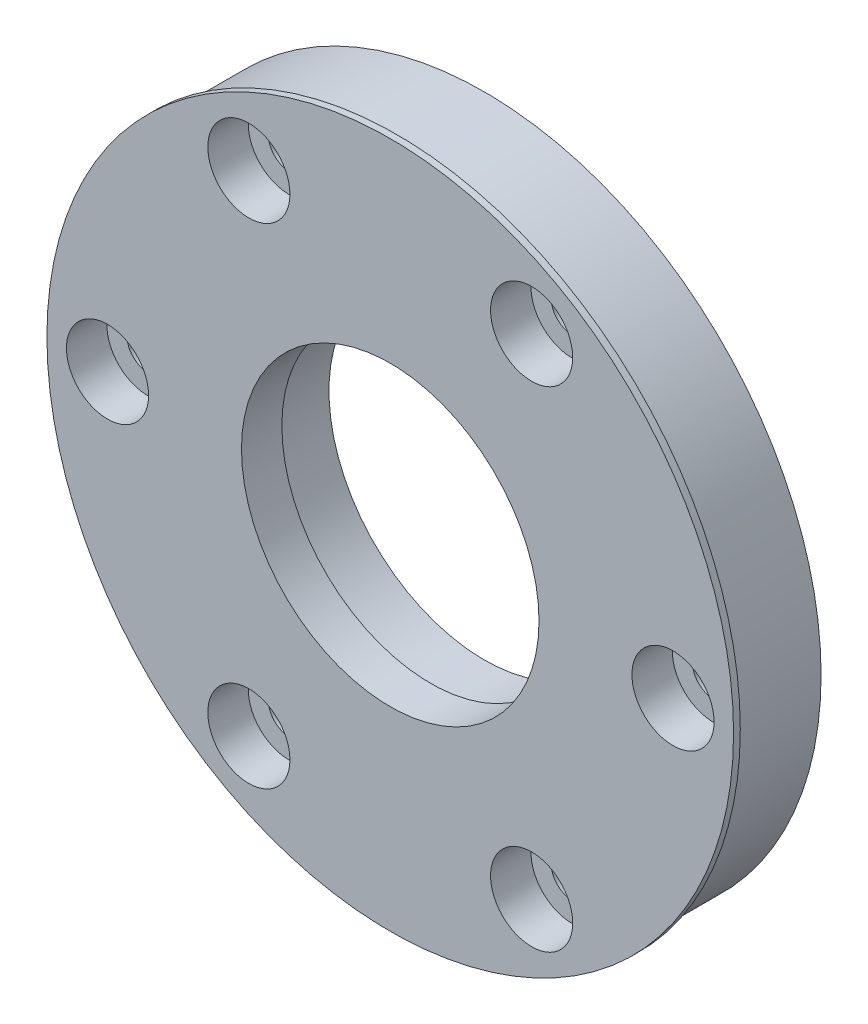
ISO-10303-21;
HEADER;
FILE_DESCRIPTION(('STEP AP214'),'2;1');
FILE_NAME('part.step','',(''),(''),'','','');
FILE_SCHEMA(('AUTOMOTIVE_DESIGN { 1 0 10303 214 1 1 1 1 }'));
ENDSEC;
DATA;
#1=APPLICATION_CONTEXT('core data for automotive mechanical design processes');
#2=APPLICATION_PROTOCOL_DEFINITION('international standard','automotive_design',2000,#1);
#3=PRODUCT_CONTEXT('',#1,'mechanical');
#4=PRODUCT('Part','Part','',(#3));
#5=PRODUCT_RELATED_PRODUCT_CATEGORY('part','',(#4));
#6=PRODUCT_DEFINITION_FORMATION('','',#4);
#7=PRODUCT_DEFINITION_CONTEXT('part definition',#1,'design');
#8=PRODUCT_DEFINITION('design','',#6,#7);
#9=PRODUCT_DEFINITION_SHAPE('','',#8);
#10=(LENGTH_UNIT() NAMED_UNIT(*) SI_UNIT(.MILLI.,.METRE.));
#11=(NAMED_UNIT(*) PLANE_ANGLE_UNIT() SI_UNIT($,.RADIAN.));
#12=(NAMED_UNIT(*) SI_UNIT($,.STERADIAN.) SOLID_ANGLE_UNIT());
#13=UNCERTAINTY_MEASURE_WITH_UNIT(LENGTH_MEASURE(1.E-05),#10,'distance_accuracy_value','');
#14=(GEOMETRIC_REPRESENTATION_CONTEXT(3) GLOBAL_UNCERTAINTY_ASSIGNED_CONTEXT((#13)) GLOBAL_UNIT_ASSIGNED_CONTEXT((#10,
#11,#12)) REPRESENTATION_CONTEXT('',''));
#15=CARTESIAN_POINT('',(0.,0.,0.));
#16=DIRECTION('',(0.,0.,1.));
#17=DIRECTION('',(1.,0.,0.));
#18=AXIS2_PLACEMENT_3D('',#15,#16,#17);
#19=CARTESIAN_POINT('',(0.,0.,0.));
#20=DIRECTION('',(0.,0.,1.));
#21=DIRECTION('',(1.,0.,0.));
#22=AXIS2_PLACEMENT_3D('',#19,#20,#21);
#23=CYLINDRICAL_SURFACE('',#22,11.55);
#24=CARTESIAN_POINT('',(0.,0.,0.));
#25=DIRECTION('',(0.,0.,1.));
#26=DIRECTION('',(1.,0.,0.));
#27=AXIS2_PLACEMENT_3D('',#24,#25,#26);
#28=CIRCLE('',#27,11.55);
#29=CARTESIAN_POINT('',(11.55,0.,0.));
#30=VERTEX_POINT('',#29);
#31=EDGE_CURVE('E202',#30,#30,#28,.T.);
#32=ORIENTED_EDGE('',*,*,#31,.F.);
#33=EDGE_LOOP('',(#32));
#34=FACE_BOUND('',#33,.T.);
#35=CARTESIAN_POINT('',(0.,0.,4.));
#36=DIRECTION('',(0.,0.,1.));
#37=DIRECTION('',(1.,0.,0.));
#38=AXIS2_PLACEMENT_3D('',#35,#36,#37);
#39=CIRCLE('',#38,11.55);
#40=CARTESIAN_POINT('',(11.55,0.,4.));
#41=VERTEX_POINT('',#40);
#42=EDGE_CURVE('E10',#41,#41,#39,.F.);
#43=ORIENTED_EDGE('',*,*,#42,.F.);
#44=EDGE_LOOP('',(#43));
#45=FACE_BOUND('',#44,.T.);
#46=ADVANCED_FACE('F43',(#34,#45),#23,.F.);
#47=CARTESIAN_POINT('',(10.5,18.1865334794732,7.));
#48=DIRECTION('',(0.,0.,-1.));
#49=DIRECTION('',(-1.,0.,0.));
#50=AXIS2_PLACEMENT_3D('',#47,#48,#49);
#51=CYLINDRICAL_SURFACE('',#50,1.55);
#52=CARTESIAN_POINT('',(10.5,18.1865334794732,4.));
#53=DIRECTION('',(0.,0.,1.));
#54=DIRECTION('',(1.,0.,0.));
#55=AXIS2_PLACEMENT_3D('',#52,#53,#54);
#56=CIRCLE('',#55,1.55);
#57=CARTESIAN_POINT('',(12.05,18.1865334794732,4.));
#58=VERTEX_POINT('',#57);
#59=EDGE_CURVE('E91',#58,#58,#56,.T.);
#60=ORIENTED_EDGE('',*,*,#59,.T.);
#61=EDGE_LOOP('',(#60));
#62=FACE_BOUND('',#61,.T.);
#63=CARTESIAN_POINT('',(10.5,18.1865334794732,1.7));
#64=DIRECTION('',(0.,0.,-1.));
#65=DIRECTION('',(-1.,0.,0.));
#66=AXIS2_PLACEMENT_3D('',#63,#64,#65);
#67=CIRCLE('',#66,1.55);
#68=CARTESIAN_POINT('',(8.95000000000001,18.1865334794732,1.7));
#69=VERTEX_POINT('',#68);
#70=EDGE_CURVE('E88',#69,#69,#67,.F.);
#71=ORIENTED_EDGE('',*,*,#70,.F.);
#72=EDGE_LOOP('',(#71));
#73=FACE_BOUND('',#72,.T.);
#74=ADVANCED_FACE('F268',(#62,#73),#51,.F.);
#75=CARTESIAN_POINT('',(-10.5,18.1865334794732,7.));
#76=DIRECTION('',(0.,0.,-1.));
#77=DIRECTION('',(-1.,0.,0.));
#78=AXIS2_PLACEMENT_3D('',#75,#76,#77);
#79=CYLINDRICAL_SURFACE('',#78,1.55);
#80=CARTESIAN_POINT('',(-10.5,18.1865334794732,4.));
#81=DIRECTION('',(0.,0.,1.));
#82=DIRECTION('',(1.,0.,0.));
#83=AXIS2_PLACEMENT_3D('',#80,#81,#82);
#84=CIRCLE('',#83,1.55);
#85=CARTESIAN_POINT('',(-8.95,18.1865334794732,4.));
#86=VERTEX_POINT('',#85);
#87=EDGE_CURVE('E97',#86,#86,#84,.T.);
#88=ORIENTED_EDGE('',*,*,#87,.T.);
#89=EDGE_LOOP('',(#88));
#90=FACE_BOUND('',#89,.T.);
#91=CARTESIAN_POINT('',(-10.5,18.1865334794732,1.7));
#92=DIRECTION('',(0.,0.,-1.));
#93=DIRECTION('',(-1.,0.,0.));
#94=AXIS2_PLACEMENT_3D('',#91,#92,#93);
#95=CIRCLE('',#94,1.55);
#96=CARTESIAN_POINT('',(-12.05,18.1865334794732,1.7));
#97=VERTEX_POINT('',#96);
#98=EDGE_CURVE('E85',#97,#97,#95,.F.);
#99=ORIENTED_EDGE('',*,*,#98,.F.);
#100=EDGE_LOOP('',(#99));
#101=FACE_BOUND('',#100,.T.);
#102=ADVANCED_FACE('F275',(#90,#101),#79,.F.);
#103=CARTESIAN_POINT('',(-21.,0.,7.));
#104=DIRECTION('',(0.,0.,-1.));
#105=DIRECTION('',(-1.,0.,0.));
#106=AXIS2_PLACEMENT_3D('',#103,#104,#105);
#107=CYLINDRICAL_SURFACE('',#106,1.55);
#108=CARTESIAN_POINT('',(-21.,0.,4.));
#109=DIRECTION('',(0.,0.,1.));
#110=DIRECTION('',(1.,0.,0.));
#111=AXIS2_PLACEMENT_3D('',#108,#109,#110);
#112=CIRCLE('',#111,1.55);
#113=CARTESIAN_POINT('',(-19.45,0.,4.));
#114=VERTEX_POINT('',#113);
#115=EDGE_CURVE('E104',#114,#114,#112,.T.);
#116=ORIENTED_EDGE('',*,*,#115,.T.);
#117=EDGE_LOOP('',(#116));
#118=FACE_BOUND('',#117,.T.);
#119=CARTESIAN_POINT('',(-21.,0.,1.7));
#120=DIRECTION('',(0.,0.,-1.));
#121=DIRECTION('',(-1.,0.,0.));
#122=AXIS2_PLACEMENT_3D('',#119,#120,#121);
#123=CIRCLE('',#122,1.55);
#124=CARTESIAN_POINT('',(-22.55,0.,1.7));
#125=VERTEX_POINT('',#124);
#126=EDGE_CURVE('E81',#125,#125,#123,.F.);
#127=ORIENTED_EDGE('',*,*,#126,.F.);
#128=EDGE_LOOP('',(#127));
#129=FACE_BOUND('',#128,.T.);
#130=ADVANCED_FACE('F505',(#118,#129),#107,.F.);
#131=CARTESIAN_POINT('',(-10.5,-18.1865334794732,7.));
#132=DIRECTION('',(0.,0.,-1.));
#133=DIRECTION('',(-1.,0.,0.));
#134=AXIS2_PLACEMENT_3D('',#131,#132,#133);
#135=CYLINDRICAL_SURFACE('',#134,1.55);
#136=CARTESIAN_POINT('',(-10.5,-18.1865334794732,4.));
#137=DIRECTION('',(0.,0.,1.));
#138=DIRECTION('',(1.,0.,0.));
#139=AXIS2_PLACEMENT_3D('',#136,#137,#138);
#140=CIRCLE('',#139,1.55);
#141=CARTESIAN_POINT('',(-8.95000000000001,-18.1865334794732,4.));
#142=VERTEX_POINT('',#141);
#143=EDGE_CURVE('E113',#142,#142,#140,.T.);
#144=ORIENTED_EDGE('',*,*,#143,.T.);
#145=EDGE_LOOP('',(#144));
#146=FACE_BOUND('',#145,.T.);
#147=CARTESIAN_POINT('',(-10.5,-18.1865334794732,1.7));
#148=DIRECTION('',(0.,0.,-1.));
#149=DIRECTION('',(-1.,0.,0.));
#150=AXIS2_PLACEMENT_3D('',#147,#148,#149);
#151=CIRCLE('',#150,1.55);
#152=CARTESIAN_POINT('',(-12.05,-18.1865334794732,1.7));
#153=VERTEX_POINT('',#152);
#154=EDGE_CURVE('E78',#153,#153,#151,.F.);
#155=ORIENTED_EDGE('',*,*,#154,.F.);
#156=EDGE_LOOP('',(#155));
#157=FACE_BOUND('',#156,.T.);
#158=ADVANCED_FACE('F513',(#146,#157),#135,.F.);
#159=CARTESIAN_POINT('',(10.5,-18.1865334794732,7.));
#160=DIRECTION('',(0.,0.,-1.));
#161=DIRECTION('',(-1.,0.,0.));
#162=AXIS2_PLACEMENT_3D('',#159,#160,#161);
#163=CYLINDRICAL_SURFACE('',#162,1.55);
#164=CARTESIAN_POINT('',(10.5,-18.1865334794732,4.));
#165=DIRECTION('',(0.,0.,1.));
#166=DIRECTION('',(1.,0.,0.));
#167=AXIS2_PLACEMENT_3D('',#164,#165,#166);
#168=CIRCLE('',#167,1.55);
#169=CARTESIAN_POINT('',(12.05,-18.1865334794732,4.));
#170=VERTEX_POINT('',#169);
#171=EDGE_CURVE('E116',#170,#170,#168,.T.);
#172=ORIENTED_EDGE('',*,*,#171,.T.);
#173=EDGE_LOOP('',(#172));
#174=FACE_BOUND('',#173,.T.);
#175=CARTESIAN_POINT('',(10.5,-18.1865334794732,1.7));
#176=DIRECTION('',(0.,0.,-1.));
#177=DIRECTION('',(-1.,0.,0.));
#178=AXIS2_PLACEMENT_3D('',#175,#176,#177);
#179=CIRCLE('',#178,1.55);
#180=CARTESIAN_POINT('',(8.94999999999999,-18.1865334794732,1.7));
#181=VERTEX_POINT('',#180);
#182=EDGE_CURVE('E74',#181,#181,#179,.F.);
#183=ORIENTED_EDGE('',*,*,#182,.F.);
#184=EDGE_LOOP('',(#183));
#185=FACE_BOUND('',#184,.T.);
#186=ADVANCED_FACE('F521',(#174,#185),#163,.F.);
#187=CARTESIAN_POINT('',(21.,0.,7.));
#188=DIRECTION('',(0.,0.,-1.));
#189=DIRECTION('',(-1.,0.,0.));
#190=AXIS2_PLACEMENT_3D('',#187,#188,#189);
#191=CYLINDRICAL_SURFACE('',#190,1.55);
#192=CARTESIAN_POINT('',(21.,0.,4.));
#193=DIRECTION('',(0.,0.,1.));
#194=DIRECTION('',(1.,0.,0.));
#195=AXIS2_PLACEMENT_3D('',#192,#193,#194);
#196=CIRCLE('',#195,1.55);
#197=CARTESIAN_POINT('',(22.55,0.,4.));
#198=VERTEX_POINT('',#197);
#199=EDGE_CURVE('E119',#198,#198,#196,.T.);
#200=ORIENTED_EDGE('',*,*,#199,.T.);
#201=EDGE_LOOP('',(#200));
#202=FACE_BOUND('',#201,.T.);
#203=CARTESIAN_POINT('',(21.,0.,1.7));
#204=DIRECTION('',(0.,0.,-1.));
#205=DIRECTION('',(-1.,0.,0.));
#206=AXIS2_PLACEMENT_3D('',#203,#204,#205);
#207=CIRCLE('',#206,1.55);
#208=CARTESIAN_POINT('',(19.45,0.,1.7));
#209=VERTEX_POINT('',#208);
#210=EDGE_CURVE('E70',#209,#209,#207,.F.);
#211=ORIENTED_EDGE('',*,*,#210,.F.);
#212=EDGE_LOOP('',(#211));
#213=FACE_BOUND('',#212,.T.);
#214=ADVANCED_FACE('F183',(#202,#213),#191,.F.);
#215=CARTESIAN_POINT('',(0.,0.,7.));
#216=DIRECTION('',(0.,0.,1.));
#217=DIRECTION('',(1.,0.,0.));
#218=AXIS2_PLACEMENT_3D('',#215,#216,#217);
#219=PLANE('',#218);
#220=CARTESIAN_POINT('',(-21.,1.46638343828664E-13,7.));
#221=DIRECTION('',(0.,0.,1.));
#222=DIRECTION('',(1.,0.,0.));
#223=AXIS2_PLACEMENT_3D('',#220,#221,#222);
#224=CIRCLE('',#223,3.05);
#225=CARTESIAN_POINT('',(-17.95,1.46638343828664E-13,7.));
#226=VERTEX_POINT('',#225);
#227=EDGE_CURVE('E133',#226,#226,#224,.T.);
#228=ORIENTED_EDGE('',*,*,#227,.F.);
#229=EDGE_LOOP('',(#228));
#230=FACE_BOUND('',#229,.T.);
#231=CARTESIAN_POINT('',(-10.5000000000003,-18.186533479473,7.));
#232=DIRECTION('',(0.,0.,1.));
#233=DIRECTION('',(1.,0.,0.));
#234=AXIS2_PLACEMENT_3D('',#231,#232,#233);
#235=CIRCLE('',#234,3.05);
#236=CARTESIAN_POINT('',(-7.45000000000034,-18.186533479473,7.));
#237=VERTEX_POINT('',#236);
#238=EDGE_CURVE('E137',#237,#237,#235,.T.);
#239=ORIENTED_EDGE('',*,*,#238,.F.);
#240=EDGE_LOOP('',(#239));
#241=FACE_BOUND('',#240,.T.);
#242=CARTESIAN_POINT('',(10.5000000000001,-18.1865334794728,7.));
#243=DIRECTION('',(0.,0.,1.));
#244=DIRECTION('',(1.,0.,0.));
#245=AXIS2_PLACEMENT_3D('',#242,#243,#244);
#246=CIRCLE('',#245,3.05);
#247=CARTESIAN_POINT('',(13.5500000000001,-18.1865334794728,7.));
#248=VERTEX_POINT('',#247);
#249=EDGE_CURVE('E165',#248,#248,#246,.T.);
#250=ORIENTED_EDGE('',*,*,#249,.F.);
#251=EDGE_LOOP('',(#250));
#252=FACE_BOUND('',#251,.T.);
#253=CARTESIAN_POINT('',(21.,-1.44066585550455E-13,7.));
#254=DIRECTION('',(0.,0.,1.));
#255=DIRECTION('',(1.,0.,0.));
#256=AXIS2_PLACEMENT_3D('',#253,#254,#255);
#257=CIRCLE('',#256,3.05);
#258=CARTESIAN_POINT('',(24.05,-1.44066585550455E-13,7.));
#259=VERTEX_POINT('',#258);
#260=EDGE_CURVE('E157',#259,#259,#257,.T.);
#261=ORIENTED_EDGE('',*,*,#260,.F.);
#262=EDGE_LOOP('',(#261));
#263=FACE_BOUND('',#262,.T.);
#264=CARTESIAN_POINT('',(10.4999999999999,18.1865334794736,7.));
#265=DIRECTION('',(0.,0.,1.));
#266=DIRECTION('',(1.,0.,0.));
#267=AXIS2_PLACEMENT_3D('',#264,#265,#266);
#268=CIRCLE('',#267,3.05);
#269=CARTESIAN_POINT('',(13.5499999999999,18.1865334794736,7.));
#270=VERTEX_POINT('',#269);
#271=EDGE_CURVE('E150',#270,#270,#268,.T.);
#272=ORIENTED_EDGE('',*,*,#271,.F.);
#273=EDGE_LOOP('',(#272));
#274=FACE_BOUND('',#273,.T.);
#275=CARTESIAN_POINT('',(-10.4999999999998,18.1865334794733,7.));
#276=DIRECTION('',(0.,0.,1.));
#277=DIRECTION('',(1.,0.,0.));
#278=AXIS2_PLACEMENT_3D('',#275,#276,#277);
#279=CIRCLE('',#278,3.05);
#280=CARTESIAN_POINT('',(-7.44999999999983,18.1865334794733,7.));
#281=VERTEX_POINT('',#280);
#282=EDGE_CURVE('E136',#281,#281,#279,.T.);
#283=ORIENTED_EDGE('',*,*,#282,.F.);
#284=EDGE_LOOP('',(#283));
#285=FACE_BOUND('',#284,.T.);
#286=CARTESIAN_POINT('',(0.,0.,7.));
#287=DIRECTION('',(0.,0.,1.));
#288=DIRECTION('',(1.,0.,0.));
#289=AXIS2_PLACEMENT_3D('',#286,#287,#288);
#290=CIRCLE('',#289,25.5);
#291=CARTESIAN_POINT('',(25.5,0.,7.));
#292=VERTEX_POINT('',#291);
#293=EDGE_CURVE('E123',#292,#292,#290,.T.);
#294=ORIENTED_EDGE('',*,*,#293,.T.);
#295=EDGE_LOOP('',(#294));
#296=FACE_BOUND('',#295,.T.);
#297=CARTESIAN_POINT('',(0.,0.,7.));
#298=DIRECTION('',(0.,0.,1.));
#299=DIRECTION('',(1.,0.,0.));
#300=AXIS2_PLACEMENT_3D('',#297,#298,#299);
#301=CIRCLE('',#300,11.05);
#302=CARTESIAN_POINT('',(11.05,0.,7.));
#303=VERTEX_POINT('',#302);
#304=EDGE_CURVE('E196',#303,#303,#301,.T.);
#305=ORIENTED_EDGE('',*,*,#304,.F.);
#306=EDGE_LOOP('',(#305));
#307=FACE_BOUND('',#306,.T.);
#308=ADVANCED_FACE('F179',(#230,#241,#252,#263,#274,#285,#296,#307),#219,.T.);
#309=CARTESIAN_POINT('',(-10.4999999999998,18.1865334794733,4.));
#310=DIRECTION('',(0.,0.,1.));
#311=DIRECTION('',(1.,0.,0.));
#312=AXIS2_PLACEMENT_3D('',#309,#310,#311);
#313=CYLINDRICAL_SURFACE('',#312,3.05);
#314=CARTESIAN_POINT('',(-10.4999999999998,18.1865334794733,4.));
#315=DIRECTION('',(0.,0.,1.));
#316=DIRECTION('',(1.,0.,0.));
#317=AXIS2_PLACEMENT_3D('',#314,#315,#316);
#318=CIRCLE('',#317,3.05);
#319=CARTESIAN_POINT('',(-7.44999999999983,18.1865334794733,4.));
#320=VERTEX_POINT('',#319);
#321=EDGE_CURVE('E146',#320,#320,#318,.T.);
#322=ORIENTED_EDGE('',*,*,#321,.F.);
#323=EDGE_LOOP('',(#322));
#324=FACE_BOUND('',#323,.T.);
#325=ORIENTED_EDGE('',*,*,#282,.T.);
#326=EDGE_LOOP('',(#325));
#327=FACE_BOUND('',#326,.T.);
#328=ADVANCED_FACE('F182',(#324,#327),#313,.F.);
#329=CARTESIAN_POINT('',(-10.4999999999998,18.1865334794733,4.));
#330=DIRECTION('',(0.,0.,1.));
#331=DIRECTION('',(1.,0.,0.));
#332=AXIS2_PLACEMENT_3D('',#329,#330,#331);
#333=PLANE('',#332);
#334=ORIENTED_EDGE('',*,*,#87,.F.);
#335=EDGE_LOOP('',(#334));
#336=FACE_BOUND('',#335,.T.);
#337=ORIENTED_EDGE('',*,*,#321,.T.);
#338=EDGE_LOOP('',(#337));
#339=FACE_BOUND('',#338,.T.);
#340=ADVANCED_FACE('F610',(#336,#339),#333,.T.);
#341=CARTESIAN_POINT('',(10.4999999999999,18.1865334794736,4.));
#342=DIRECTION('',(0.,0.,1.));
#343=DIRECTION('',(1.,0.,0.));
#344=AXIS2_PLACEMENT_3D('',#341,#342,#343);
#345=CYLINDRICAL_SURFACE('',#344,3.05);
#346=CARTESIAN_POINT('',(10.4999999999999,18.1865334794736,4.));
#347=DIRECTION('',(0.,0.,1.));
#348=DIRECTION('',(1.,0.,0.));
#349=AXIS2_PLACEMENT_3D('',#346,#347,#348);
#350=CIRCLE('',#349,3.05);
#351=CARTESIAN_POINT('',(13.5499999999999,18.1865334794736,4.));
#352=VERTEX_POINT('',#351);
#353=EDGE_CURVE('E153',#352,#352,#350,.T.);
#354=ORIENTED_EDGE('',*,*,#353,.F.);
#355=EDGE_LOOP('',(#354));
#356=FACE_BOUND('',#355,.T.);
#357=ORIENTED_EDGE('',*,*,#271,.T.);
#358=EDGE_LOOP('',(#357));
#359=FACE_BOUND('',#358,.T.);
#360=ADVANCED_FACE('F618',(#356,#359),#345,.F.);
#361=CARTESIAN_POINT('',(10.4999999999999,18.1865334794736,4.));
#362=DIRECTION('',(0.,0.,1.));
#363=DIRECTION('',(1.,0.,0.));
#364=AXIS2_PLACEMENT_3D('',#361,#362,#363);
#365=PLANE('',#364);
#366=ORIENTED_EDGE('',*,*,#59,.F.);
#367=EDGE_LOOP('',(#366));
#368=FACE_BOUND('',#367,.T.);
#369=ORIENTED_EDGE('',*,*,#353,.T.);
#370=EDGE_LOOP('',(#369));
#371=FACE_BOUND('',#370,.T.);
#372=ADVANCED_FACE('F345',(#368,#371),#365,.T.);
#373=CARTESIAN_POINT('',(21.,-1.44066585550455E-13,4.));
#374=DIRECTION('',(0.,0.,1.));
#375=DIRECTION('',(1.,0.,0.));
#376=AXIS2_PLACEMENT_3D('',#373,#374,#375);
#377=CYLINDRICAL_SURFACE('',#376,3.05);
#378=CARTESIAN_POINT('',(21.,-1.44066585550455E-13,4.));
#379=DIRECTION('',(0.,0.,1.));
#380=DIRECTION('',(1.,0.,0.));
#381=AXIS2_PLACEMENT_3D('',#378,#379,#380);
#382=CIRCLE('',#381,3.05);
#383=CARTESIAN_POINT('',(24.05,-1.44066585550455E-13,4.));
#384=VERTEX_POINT('',#383);
#385=EDGE_CURVE('E161',#384,#384,#382,.T.);
#386=ORIENTED_EDGE('',*,*,#385,.F.);
#387=EDGE_LOOP('',(#386));
#388=FACE_BOUND('',#387,.T.);
#389=ORIENTED_EDGE('',*,*,#260,.T.);
#390=EDGE_LOOP('',(#389));
#391=FACE_BOUND('',#390,.T.);
#392=ADVANCED_FACE('F343',(#388,#391),#377,.F.);
#393=CARTESIAN_POINT('',(21.,-1.44066585550455E-13,4.));
#394=DIRECTION('',(0.,0.,1.));
#395=DIRECTION('',(1.,0.,0.));
#396=AXIS2_PLACEMENT_3D('',#393,#394,#395);
#397=PLANE('',#396);
#398=ORIENTED_EDGE('',*,*,#199,.F.);
#399=EDGE_LOOP('',(#398));
#400=FACE_BOUND('',#399,.T.);
#401=ORIENTED_EDGE('',*,*,#385,.T.);
#402=EDGE_LOOP('',(#401));
#403=FACE_BOUND('',#402,.T.);
#404=ADVANCED_FACE('F175',(#400,#403),#397,.T.);
#405=CARTESIAN_POINT('',(10.5000000000001,-18.1865334794728,4.));
#406=DIRECTION('',(0.,0.,1.));
#407=DIRECTION('',(1.,0.,0.));
#408=AXIS2_PLACEMENT_3D('',#405,#406,#407);
#409=CYLINDRICAL_SURFACE('',#408,3.05);
#410=CARTESIAN_POINT('',(10.5000000000001,-18.1865334794728,4.));
#411=DIRECTION('',(0.,0.,1.));
#412=DIRECTION('',(1.,0.,0.));
#413=AXIS2_PLACEMENT_3D('',#410,#411,#412);
#414=CIRCLE('',#413,3.05);
#415=CARTESIAN_POINT('',(13.5500000000001,-18.1865334794728,4.));
#416=VERTEX_POINT('',#415);
#417=EDGE_CURVE('E140',#416,#416,#414,.T.);
#418=ORIENTED_EDGE('',*,*,#417,.F.);
#419=EDGE_LOOP('',(#418));
#420=FACE_BOUND('',#419,.T.);
#421=ORIENTED_EDGE('',*,*,#249,.T.);
#422=EDGE_LOOP('',(#421));
#423=FACE_BOUND('',#422,.T.);
#424=ADVANCED_FACE('F172',(#420,#423),#409,.F.);
#425=CARTESIAN_POINT('',(10.5000000000001,-18.1865334794728,4.));
#426=DIRECTION('',(0.,0.,1.));
#427=DIRECTION('',(1.,0.,0.));
#428=AXIS2_PLACEMENT_3D('',#425,#426,#427);
#429=PLANE('',#428);
#430=ORIENTED_EDGE('',*,*,#171,.F.);
#431=EDGE_LOOP('',(#430));
#432=FACE_BOUND('',#431,.T.);
#433=ORIENTED_EDGE('',*,*,#417,.T.);
#434=EDGE_LOOP('',(#433));
#435=FACE_BOUND('',#434,.T.);
#436=ADVANCED_FACE('F170',(#432,#435),#429,.T.);
#437=CARTESIAN_POINT('',(-10.5000000000003,-18.186533479473,4.));
#438=DIRECTION('',(0.,0.,1.));
#439=DIRECTION('',(1.,0.,0.));
#440=AXIS2_PLACEMENT_3D('',#437,#438,#439);
#441=CYLINDRICAL_SURFACE('',#440,3.05);
#442=CARTESIAN_POINT('',(-10.5000000000003,-18.186533479473,4.));
#443=DIRECTION('',(0.,0.,1.));
#444=DIRECTION('',(1.,0.,0.));
#445=AXIS2_PLACEMENT_3D('',#442,#443,#444);
#446=CIRCLE('',#445,3.05);
#447=CARTESIAN_POINT('',(-7.45000000000034,-18.186533479473,4.));
#448=VERTEX_POINT('',#447);
#449=EDGE_CURVE('E127',#448,#448,#446,.T.);
#450=ORIENTED_EDGE('',*,*,#449,.F.);
#451=EDGE_LOOP('',(#450));
#452=FACE_BOUND('',#451,.T.);
#453=ORIENTED_EDGE('',*,*,#238,.T.);
#454=EDGE_LOOP('',(#453));
#455=FACE_BOUND('',#454,.T.);
#456=ADVANCED_FACE('F451',(#452,#455),#441,.F.);
#457=CARTESIAN_POINT('',(-10.5000000000003,-18.186533479473,4.));
#458=DIRECTION('',(0.,0.,1.));
#459=DIRECTION('',(1.,0.,0.));
#460=AXIS2_PLACEMENT_3D('',#457,#458,#459);
#461=PLANE('',#460);
#462=ORIENTED_EDGE('',*,*,#143,.F.);
#463=EDGE_LOOP('',(#462));
#464=FACE_BOUND('',#463,.T.);
#465=ORIENTED_EDGE('',*,*,#449,.T.);
#466=EDGE_LOOP('',(#465));
#467=FACE_BOUND('',#466,.T.);
#468=ADVANCED_FACE('F443',(#464,#467),#461,.T.);
#469=CARTESIAN_POINT('',(-21.,1.46638343828664E-13,4.));
#470=DIRECTION('',(0.,0.,1.));
#471=DIRECTION('',(1.,0.,0.));
#472=AXIS2_PLACEMENT_3D('',#469,#470,#471);
#473=CYLINDRICAL_SURFACE('',#472,3.05);
#474=CARTESIAN_POINT('',(-21.,1.46638343828664E-13,4.));
#475=DIRECTION('',(0.,0.,1.));
#476=DIRECTION('',(1.,0.,0.));
#477=AXIS2_PLACEMENT_3D('',#474,#475,#476);
#478=CIRCLE('',#477,3.05);
#479=CARTESIAN_POINT('',(-17.95,1.46638343828664E-13,4.));
#480=VERTEX_POINT('',#479);
#481=EDGE_CURVE('E66',#480,#480,#478,.T.);
#482=ORIENTED_EDGE('',*,*,#481,.F.);
#483=EDGE_LOOP('',(#482));
#484=FACE_BOUND('',#483,.T.);
#485=ORIENTED_EDGE('',*,*,#227,.T.);
#486=EDGE_LOOP('',(#485));
#487=FACE_BOUND('',#486,.T.);
#488=ADVANCED_FACE('F439',(#484,#487),#473,.F.);
#489=CARTESIAN_POINT('',(-21.,1.46638343828664E-13,4.));
#490=DIRECTION('',(0.,0.,1.));
#491=DIRECTION('',(1.,0.,0.));
#492=AXIS2_PLACEMENT_3D('',#489,#490,#491);
#493=PLANE('',#492);
#494=ORIENTED_EDGE('',*,*,#115,.F.);
#495=EDGE_LOOP('',(#494));
#496=FACE_BOUND('',#495,.T.);
#497=ORIENTED_EDGE('',*,*,#481,.T.);
#498=EDGE_LOOP('',(#497));
#499=FACE_BOUND('',#498,.T.);
#500=ADVANCED_FACE('F433',(#496,#499),#493,.T.);
#501=CARTESIAN_POINT('',(0.,0.,6.5));
#502=DIRECTION('',(0.,0.,1.));
#503=DIRECTION('',(1.,0.,0.));
#504=AXIS2_PLACEMENT_3D('',#501,#502,#503);
#505=CYLINDRICAL_SURFACE('',#504,25.5);
#506=CARTESIAN_POINT('',(0.,0.,6.5));
#507=DIRECTION('',(0.,0.,1.));
#508=DIRECTION('',(1.,0.,0.));
#509=AXIS2_PLACEMENT_3D('',#506,#507,#508);
#510=CIRCLE('',#509,25.5);
#511=CARTESIAN_POINT('',(25.5,0.,6.5));
#512=VERTEX_POINT('',#511);
#513=EDGE_CURVE('E124',#512,#512,#510,.T.);
#514=ORIENTED_EDGE('',*,*,#513,.T.);
#515=EDGE_LOOP('',(#514));
#516=FACE_BOUND('',#515,.T.);
#517=ORIENTED_EDGE('',*,*,#293,.F.);
#518=EDGE_LOOP('',(#517));
#519=FACE_BOUND('',#518,.T.);
#520=ADVANCED_FACE('F421',(#516,#519),#505,.T.);
#521=CARTESIAN_POINT('',(0.,0.,6.5));
#522=DIRECTION('',(0.,0.,1.));
#523=DIRECTION('',(1.,0.,0.));
#524=AXIS2_PLACEMENT_3D('',#521,#522,#523);
#525=PLANE('',#524);
#526=CARTESIAN_POINT('',(0.,0.,6.5));
#527=DIRECTION('',(0.,0.,1.));
#528=DIRECTION('',(1.,0.,0.));
#529=AXIS2_PLACEMENT_3D('',#526,#527,#528);
#530=CIRCLE('',#529,25.);
#531=CARTESIAN_POINT('',(25.,0.,6.5));
#532=VERTEX_POINT('',#531);
#533=EDGE_CURVE('E51',#532,#532,#530,.T.);
#534=ORIENTED_EDGE('',*,*,#533,.T.);
#535=EDGE_LOOP('',(#534));
#536=FACE_BOUND('',#535,.T.);
#537=ORIENTED_EDGE('',*,*,#513,.F.);
#538=EDGE_LOOP('',(#537));
#539=FACE_BOUND('',#538,.T.);
#540=ADVANCED_FACE('F325',(#536,#539),#525,.F.);
#541=CARTESIAN_POINT('',(0.,0.,0.));
#542=DIRECTION('',(0.,0.,1.));
#543=DIRECTION('',(1.,0.,0.));
#544=AXIS2_PLACEMENT_3D('',#541,#542,#543);
#545=PLANE('',#544);
#546=ORIENTED_EDGE('',*,*,#31,.T.);
#547=EDGE_LOOP('',(#546));
#548=FACE_BOUND('',#547,.T.);
#549=CARTESIAN_POINT('',(21.,0.,0.));
#550=DIRECTION('',(0.,0.,-1.));
#551=DIRECTION('',(-1.,0.,0.));
#552=AXIS2_PLACEMENT_3D('',#549,#550,#551);
#553=CIRCLE('',#552,3.);
#554=CARTESIAN_POINT('',(18.,0.,0.));
#555=VERTEX_POINT('',#554);
#556=EDGE_CURVE('E212',#555,#555,#553,.T.);
#557=ORIENTED_EDGE('',*,*,#556,.F.);
#558=EDGE_LOOP('',(#557));
#559=FACE_BOUND('',#558,.T.);
#560=CARTESIAN_POINT('',(10.5000000000002,-18.1865334794731,0.));
#561=DIRECTION('',(0.,0.,-1.));
#562=DIRECTION('',(-1.,0.,0.));
#563=AXIS2_PLACEMENT_3D('',#560,#561,#562);
#564=CIRCLE('',#563,3.);
#565=CARTESIAN_POINT('',(7.50000000000022,-18.1865334794731,0.));
#566=VERTEX_POINT('',#565);
#567=EDGE_CURVE('E217',#566,#566,#564,.T.);
#568=ORIENTED_EDGE('',*,*,#567,.F.);
#569=EDGE_LOOP('',(#568));
#570=FACE_BOUND('',#569,.T.);
#571=CARTESIAN_POINT('',(-10.4999999999998,-18.1865334794733,0.));
#572=DIRECTION('',(0.,0.,-1.));
#573=DIRECTION('',(-1.,0.,0.));
#574=AXIS2_PLACEMENT_3D('',#571,#572,#573);
#575=CIRCLE('',#574,3.);
#576=CARTESIAN_POINT('',(-13.4999999999998,-18.1865334794733,0.));
#577=VERTEX_POINT('',#576);
#578=EDGE_CURVE('E243',#577,#577,#575,.T.);
#579=ORIENTED_EDGE('',*,*,#578,.F.);
#580=EDGE_LOOP('',(#579));
#581=FACE_BOUND('',#580,.T.);
#582=CARTESIAN_POINT('',(-21.,-1.4658413372004E-13,0.));
#583=DIRECTION('',(0.,0.,-1.));
#584=DIRECTION('',(-1.,0.,0.));
#585=AXIS2_PLACEMENT_3D('',#582,#583,#584);
#586=CIRCLE('',#585,3.);
#587=CARTESIAN_POINT('',(-24.,-1.4658413372004E-13,0.));
#588=VERTEX_POINT('',#587);
#589=EDGE_CURVE('E236',#588,#588,#586,.T.);
#590=ORIENTED_EDGE('',*,*,#589,.F.);
#591=EDGE_LOOP('',(#590));
#592=FACE_BOUND('',#591,.T.);
#593=CARTESIAN_POINT('',(-10.5000000000001,18.1865334794732,0.));
#594=DIRECTION('',(0.,0.,-1.));
#595=DIRECTION('',(-1.,0.,0.));
#596=AXIS2_PLACEMENT_3D('',#593,#594,#595);
#597=CIRCLE('',#596,3.);
#598=CARTESIAN_POINT('',(-13.5000000000001,18.1865334794732,0.));
#599=VERTEX_POINT('',#598);
#600=EDGE_CURVE('E229',#599,#599,#597,.T.);
#601=ORIENTED_EDGE('',*,*,#600,.F.);
#602=EDGE_LOOP('',(#601));
#603=FACE_BOUND('',#602,.T.);
#604=CARTESIAN_POINT('',(10.5,18.1865334794732,0.));
#605=DIRECTION('',(0.,0.,-1.));
#606=DIRECTION('',(-1.,0.,0.));
#607=AXIS2_PLACEMENT_3D('',#604,#605,#606);
#608=CIRCLE('',#607,3.);
#609=CARTESIAN_POINT('',(7.49999999999996,18.1865334794732,0.));
#610=VERTEX_POINT('',#609);
#611=EDGE_CURVE('E216',#610,#610,#608,.T.);
#612=ORIENTED_EDGE('',*,*,#611,.F.);
#613=EDGE_LOOP('',(#612));
#614=FACE_BOUND('',#613,.T.);
#615=CARTESIAN_POINT('',(0.,0.,0.));
#616=DIRECTION('',(0.,0.,1.));
#617=DIRECTION('',(1.,0.,0.));
#618=AXIS2_PLACEMENT_3D('',#615,#616,#617);
#619=CIRCLE('',#618,25.);
#620=CARTESIAN_POINT('',(25.,0.,0.));
#621=VERTEX_POINT('',#620);
#622=EDGE_CURVE('E58',#621,#621,#619,.T.);
#623=ORIENTED_EDGE('',*,*,#622,.F.);
#624=EDGE_LOOP('',(#623));
#625=FACE_BOUND('',#624,.T.);
#626=ADVANCED_FACE('F322',(#548,#559,#570,#581,#592,#603,#614,#625),#545,.F.);
#627=CARTESIAN_POINT('',(0.,0.,7.));
#628=DIRECTION('',(0.,0.,-1.));
#629=DIRECTION('',(-1.,0.,0.));
#630=AXIS2_PLACEMENT_3D('',#627,#628,#629);
#631=CYLINDRICAL_SURFACE('',#630,25.);
#632=ORIENTED_EDGE('',*,*,#622,.T.);
#633=EDGE_LOOP('',(#632));
#634=FACE_BOUND('',#633,.T.);
#635=ORIENTED_EDGE('',*,*,#533,.F.);
#636=EDGE_LOOP('',(#635));
#637=FACE_BOUND('',#636,.T.);
#638=ADVANCED_FACE('F45',(#634,#637),#631,.T.);
#639=CARTESIAN_POINT('',(21.,0.,1.7));
#640=DIRECTION('',(0.,0.,-1.));
#641=DIRECTION('',(-1.,0.,0.));
#642=AXIS2_PLACEMENT_3D('',#639,#640,#641);
#643=PLANE('',#642);
#644=CARTESIAN_POINT('',(21.,0.,1.7));
#645=DIRECTION('',(0.,0.,-1.));
#646=DIRECTION('',(-1.,0.,0.));
#647=AXIS2_PLACEMENT_3D('',#644,#645,#646);
#648=CIRCLE('',#647,3.);
#649=CARTESIAN_POINT('',(18.,0.,1.7));
#650=VERTEX_POINT('',#649);
#651=EDGE_CURVE('E75',#650,#650,#648,.T.);
#652=ORIENTED_EDGE('',*,*,#651,.T.);
#653=EDGE_LOOP('',(#652));
#654=FACE_BOUND('',#653,.T.);
#655=ORIENTED_EDGE('',*,*,#210,.T.);
#656=EDGE_LOOP('',(#655));
#657=FACE_BOUND('',#656,.T.);
#658=ADVANCED_FACE('F283',(#654,#657),#643,.T.);
#659=CARTESIAN_POINT('',(21.,0.,1.7));
#660=DIRECTION('',(0.,0.,-1.));
#661=DIRECTION('',(-1.,0.,0.));
#662=AXIS2_PLACEMENT_3D('',#659,#660,#661);
#663=CYLINDRICAL_SURFACE('',#662,3.);
#664=ORIENTED_EDGE('',*,*,#651,.F.);
#665=EDGE_LOOP('',(#664));
#666=FACE_BOUND('',#665,.T.);
#667=ORIENTED_EDGE('',*,*,#556,.T.);
#668=EDGE_LOOP('',(#667));
#669=FACE_BOUND('',#668,.T.);
#670=ADVANCED_FACE('F286',(#666,#669),#663,.F.);
#671=CARTESIAN_POINT('',(10.5000000000002,-18.1865334794731,1.7));
#672=DIRECTION('',(0.,0.,-1.));
#673=DIRECTION('',(-1.,0.,0.));
#674=AXIS2_PLACEMENT_3D('',#671,#672,#673);
#675=PLANE('',#674);
#676=CARTESIAN_POINT('',(10.5000000000002,-18.1865334794731,1.7));
#677=DIRECTION('',(0.,0.,-1.));
#678=DIRECTION('',(-1.,0.,0.));
#679=AXIS2_PLACEMENT_3D('',#676,#677,#678);
#680=CIRCLE('',#679,3.);
#681=CARTESIAN_POINT('',(7.50000000000022,-18.1865334794731,1.7));
#682=VERTEX_POINT('',#681);
#683=EDGE_CURVE('E208',#682,#682,#680,.T.);
#684=ORIENTED_EDGE('',*,*,#683,.T.);
#685=EDGE_LOOP('',(#684));
#686=FACE_BOUND('',#685,.T.);
#687=ORIENTED_EDGE('',*,*,#182,.T.);
#688=EDGE_LOOP('',(#687));
#689=FACE_BOUND('',#688,.T.);
#690=ADVANCED_FACE('F290',(#686,#689),#675,.T.);
#691=CARTESIAN_POINT('',(10.5000000000002,-18.1865334794731,1.7));
#692=DIRECTION('',(0.,0.,-1.));
#693=DIRECTION('',(-1.,0.,0.));
#694=AXIS2_PLACEMENT_3D('',#691,#692,#693);
#695=CYLINDRICAL_SURFACE('',#694,3.);
#696=ORIENTED_EDGE('',*,*,#683,.F.);
#697=EDGE_LOOP('',(#696));
#698=FACE_BOUND('',#697,.T.);
#699=ORIENTED_EDGE('',*,*,#567,.T.);
#700=EDGE_LOOP('',(#699));
#701=FACE_BOUND('',#700,.T.);
#702=ADVANCED_FACE('F265',(#698,#701),#695,.F.);
#703=CARTESIAN_POINT('',(-10.4999999999998,-18.1865334794733,1.7));
#704=DIRECTION('',(0.,0.,-1.));
#705=DIRECTION('',(-1.,0.,0.));
#706=AXIS2_PLACEMENT_3D('',#703,#704,#705);
#707=PLANE('',#706);
#708=CARTESIAN_POINT('',(-10.4999999999998,-18.1865334794733,1.7));
#709=DIRECTION('',(0.,0.,-1.));
#710=DIRECTION('',(-1.,0.,0.));
#711=AXIS2_PLACEMENT_3D('',#708,#709,#710);
#712=CIRCLE('',#711,3.);
#713=CARTESIAN_POINT('',(-13.4999999999998,-18.1865334794733,1.7));
#714=VERTEX_POINT('',#713);
#715=EDGE_CURVE('E107',#714,#714,#712,.T.);
#716=ORIENTED_EDGE('',*,*,#715,.T.);
#717=EDGE_LOOP('',(#716));
#718=FACE_BOUND('',#717,.T.);
#719=ORIENTED_EDGE('',*,*,#154,.T.);
#720=EDGE_LOOP('',(#719));
#721=FACE_BOUND('',#720,.T.);
#722=ADVANCED_FACE('F250',(#718,#721),#707,.T.);
#723=CARTESIAN_POINT('',(-10.4999999999998,-18.1865334794733,1.7));
#724=DIRECTION('',(0.,0.,-1.));
#725=DIRECTION('',(-1.,0.,0.));
#726=AXIS2_PLACEMENT_3D('',#723,#724,#725);
#727=CYLINDRICAL_SURFACE('',#726,3.);
#728=ORIENTED_EDGE('',*,*,#715,.F.);
#729=EDGE_LOOP('',(#728));
#730=FACE_BOUND('',#729,.T.);
#731=ORIENTED_EDGE('',*,*,#578,.T.);
#732=EDGE_LOOP('',(#731));
#733=FACE_BOUND('',#732,.T.);
#734=ADVANCED_FACE('F253',(#730,#733),#727,.F.);
#735=CARTESIAN_POINT('',(-21.,-1.4658413372004E-13,1.7));
#736=DIRECTION('',(0.,0.,-1.));
#737=DIRECTION('',(-1.,0.,0.));
#738=AXIS2_PLACEMENT_3D('',#735,#736,#737);
#739=PLANE('',#738);
#740=CARTESIAN_POINT('',(-21.,-1.4658413372004E-13,1.7));
#741=DIRECTION('',(0.,0.,-1.));
#742=DIRECTION('',(-1.,0.,0.));
#743=AXIS2_PLACEMENT_3D('',#740,#741,#742);
#744=CIRCLE('',#743,3.);
#745=CARTESIAN_POINT('',(-24.,-1.4658413372004E-13,1.7));
#746=VERTEX_POINT('',#745);
#747=EDGE_CURVE('E240',#746,#746,#744,.T.);
#748=ORIENTED_EDGE('',*,*,#747,.T.);
#749=EDGE_LOOP('',(#748));
#750=FACE_BOUND('',#749,.T.);
#751=ORIENTED_EDGE('',*,*,#126,.T.);
#752=EDGE_LOOP('',(#751));
#753=FACE_BOUND('',#752,.T.);
#754=ADVANCED_FACE('F255',(#750,#753),#739,.T.);
#755=CARTESIAN_POINT('',(-21.,-1.4658413372004E-13,1.7));
#756=DIRECTION('',(0.,0.,-1.));
#757=DIRECTION('',(-1.,0.,0.));
#758=AXIS2_PLACEMENT_3D('',#755,#756,#757);
#759=CYLINDRICAL_SURFACE('',#758,3.);
#760=ORIENTED_EDGE('',*,*,#747,.F.);
#761=EDGE_LOOP('',(#760));
#762=FACE_BOUND('',#761,.T.);
#763=ORIENTED_EDGE('',*,*,#589,.T.);
#764=EDGE_LOOP('',(#763));
#765=FACE_BOUND('',#764,.T.);
#766=ADVANCED_FACE('F262',(#762,#765),#759,.F.);
#767=CARTESIAN_POINT('',(-10.5000000000001,18.1865334794732,1.7));
#768=DIRECTION('',(0.,0.,-1.));
#769=DIRECTION('',(-1.,0.,0.));
#770=AXIS2_PLACEMENT_3D('',#767,#768,#769);
#771=PLANE('',#770);
#772=CARTESIAN_POINT('',(-10.5000000000001,18.1865334794732,1.7));
#773=DIRECTION('',(0.,0.,-1.));
#774=DIRECTION('',(-1.,0.,0.));
#775=AXIS2_PLACEMENT_3D('',#772,#773,#774);
#776=CIRCLE('',#775,3.);
#777=CARTESIAN_POINT('',(-13.5000000000001,18.1865334794732,1.7));
#778=VERTEX_POINT('',#777);
#779=EDGE_CURVE('E233',#778,#778,#776,.T.);
#780=ORIENTED_EDGE('',*,*,#779,.T.);
#781=EDGE_LOOP('',(#780));
#782=FACE_BOUND('',#781,.T.);
#783=ORIENTED_EDGE('',*,*,#98,.T.);
#784=EDGE_LOOP('',(#783));
#785=FACE_BOUND('',#784,.T.);
#786=ADVANCED_FACE('F309',(#782,#785),#771,.T.);
#787=CARTESIAN_POINT('',(-10.5000000000001,18.1865334794732,1.7));
#788=DIRECTION('',(0.,0.,-1.));
#789=DIRECTION('',(-1.,0.,0.));
#790=AXIS2_PLACEMENT_3D('',#787,#788,#789);
#791=CYLINDRICAL_SURFACE('',#790,3.);
#792=ORIENTED_EDGE('',*,*,#779,.F.);
#793=EDGE_LOOP('',(#792));
#794=FACE_BOUND('',#793,.T.);
#795=ORIENTED_EDGE('',*,*,#600,.T.);
#796=EDGE_LOOP('',(#795));
#797=FACE_BOUND('',#796,.T.);
#798=ADVANCED_FACE('F305',(#794,#797),#791,.F.);
#799=CARTESIAN_POINT('',(10.5,18.1865334794732,1.7));
#800=DIRECTION('',(0.,0.,-1.));
#801=DIRECTION('',(-1.,0.,0.));
#802=AXIS2_PLACEMENT_3D('',#799,#800,#801);
#803=PLANE('',#802);
#804=CARTESIAN_POINT('',(10.5,18.1865334794732,1.7));
#805=DIRECTION('',(0.,0.,-1.));
#806=DIRECTION('',(-1.,0.,0.));
#807=AXIS2_PLACEMENT_3D('',#804,#805,#806);
#808=CIRCLE('',#807,3.);
#809=CARTESIAN_POINT('',(7.49999999999996,18.1865334794732,1.7));
#810=VERTEX_POINT('',#809);
#811=EDGE_CURVE('E225',#810,#810,#808,.T.);
#812=ORIENTED_EDGE('',*,*,#811,.T.);
#813=EDGE_LOOP('',(#812));
#814=FACE_BOUND('',#813,.T.);
#815=ORIENTED_EDGE('',*,*,#70,.T.);
#816=EDGE_LOOP('',(#815));
#817=FACE_BOUND('',#816,.T.);
#818=ADVANCED_FACE('F301',(#814,#817),#803,.T.);
#819=CARTESIAN_POINT('',(10.5,18.1865334794732,1.7));
#820=DIRECTION('',(0.,0.,-1.));
#821=DIRECTION('',(-1.,0.,0.));
#822=AXIS2_PLACEMENT_3D('',#819,#820,#821);
#823=CYLINDRICAL_SURFACE('',#822,3.);
#824=ORIENTED_EDGE('',*,*,#811,.F.);
#825=EDGE_LOOP('',(#824));
#826=FACE_BOUND('',#825,.T.);
#827=ORIENTED_EDGE('',*,*,#611,.T.);
#828=EDGE_LOOP('',(#827));
#829=FACE_BOUND('',#828,.T.);
#830=ADVANCED_FACE('F298',(#826,#829),#823,.F.);
#831=CARTESIAN_POINT('',(0.,0.,4.));
#832=DIRECTION('',(0.,0.,1.));
#833=DIRECTION('',(1.,0.,0.));
#834=AXIS2_PLACEMENT_3D('',#831,#832,#833);
#835=PLANE('',#834);
#836=CARTESIAN_POINT('',(0.,0.,4.));
#837=DIRECTION('',(0.,0.,1.));
#838=DIRECTION('',(1.,0.,0.));
#839=AXIS2_PLACEMENT_3D('',#836,#837,#838);
#840=CIRCLE('',#839,11.05);
#841=CARTESIAN_POINT('',(11.05,0.,4.));
#842=VERTEX_POINT('',#841);
#843=EDGE_CURVE('E199',#842,#842,#840,.T.);
#844=ORIENTED_EDGE('',*,*,#843,.T.);
#845=EDGE_LOOP('',(#844));
#846=FACE_BOUND('',#845,.T.);
#847=ORIENTED_EDGE('',*,*,#42,.T.);
#848=EDGE_LOOP('',(#847));
#849=FACE_BOUND('',#848,.T.);
#850=ADVANCED_FACE('F281',(#846,#849),#835,.F.);
#851=CARTESIAN_POINT('',(0.,0.,4.));
#852=DIRECTION('',(0.,0.,1.));
#853=DIRECTION('',(1.,0.,0.));
#854=AXIS2_PLACEMENT_3D('',#851,#852,#853);
#855=CYLINDRICAL_SURFACE('',#854,11.05);
#856=ORIENTED_EDGE('',*,*,#843,.F.);
#857=EDGE_LOOP('',(#856));
#858=FACE_BOUND('',#857,.T.);
#859=ORIENTED_EDGE('',*,*,#304,.T.);
#860=EDGE_LOOP('',(#859));
#861=FACE_BOUND('',#860,.T.);
#862=ADVANCED_FACE('F351',(#858,#861),#855,.F.);
#863=CLOSED_SHELL('',(#46,#74,#102,#130,#158,#186,#214,#308,#328,#340,#360,#372,#392,#404,#424,
#436,#456,#468,#488,#500,#520,#540,#626,#638,#658,#670,#690,#702,#722,#734,#754,#766,#786,#798,
#818,#830,#850,#862));
#864=MANIFOLD_SOLID_BREP('B2',#863);
#865=ADVANCED_BREP_SHAPE_REPRESENTATION('',(#18,#864),#14);
#866=SHAPE_DEFINITION_REPRESENTATION(#9,#865);
ENDSEC;
END-ISO-10303-21;
